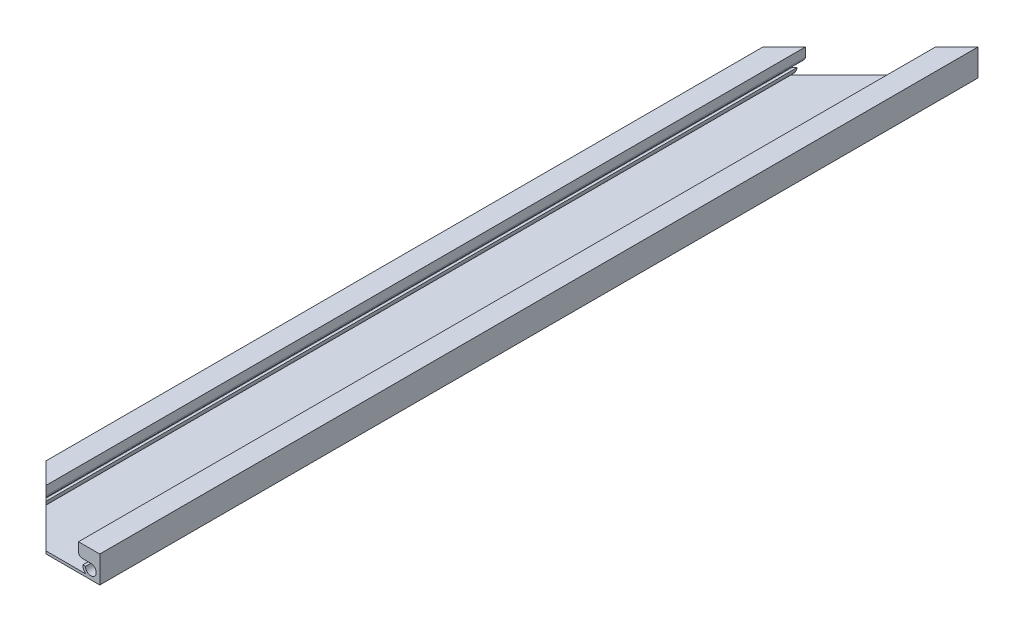
ISO-10303-21;
HEADER;
FILE_DESCRIPTION(('STEP AP214'),'2;1');
FILE_NAME('part.step','',(''),(''),'','','');
FILE_SCHEMA(('AUTOMOTIVE_DESIGN { 1 0 10303 214 1 1 1 1 }'));
ENDSEC;
DATA;
#1=APPLICATION_CONTEXT('core data for automotive mechanical design processes');
#2=APPLICATION_PROTOCOL_DEFINITION('international standard','automotive_design',2000,#1);
#3=PRODUCT_CONTEXT('',#1,'mechanical');
#4=PRODUCT('Part','Part','',(#3));
#5=PRODUCT_RELATED_PRODUCT_CATEGORY('part','',(#4));
#6=PRODUCT_DEFINITION_FORMATION('','',#4);
#7=PRODUCT_DEFINITION_CONTEXT('part definition',#1,'design');
#8=PRODUCT_DEFINITION('design','',#6,#7);
#9=PRODUCT_DEFINITION_SHAPE('','',#8);
#10=(LENGTH_UNIT() NAMED_UNIT(*) SI_UNIT(.MILLI.,.METRE.));
#11=(NAMED_UNIT(*) PLANE_ANGLE_UNIT() SI_UNIT($,.RADIAN.));
#12=(NAMED_UNIT(*) SI_UNIT($,.STERADIAN.) SOLID_ANGLE_UNIT());
#13=UNCERTAINTY_MEASURE_WITH_UNIT(LENGTH_MEASURE(1.E-05),#10,'distance_accuracy_value','');
#14=(GEOMETRIC_REPRESENTATION_CONTEXT(3) GLOBAL_UNCERTAINTY_ASSIGNED_CONTEXT((#13)) GLOBAL_UNIT_ASSIGNED_CONTEXT((#10,
#11,#12)) REPRESENTATION_CONTEXT('',''));
#15=CARTESIAN_POINT('',(0.,0.,0.));
#16=DIRECTION('',(0.,0.,1.));
#17=DIRECTION('',(1.,0.,0.));
#18=AXIS2_PLACEMENT_3D('',#15,#16,#17);
#19=CARTESIAN_POINT('',(-30.,7.5,520.));
#20=DIRECTION('',(0.,-1.,0.));
#21=DIRECTION('',(0.,0.,-1.));
#22=AXIS2_PLACEMENT_3D('',#19,#20,#21);
#23=PLANE('',#22);
#24=DIRECTION('',(0.707106781186546,0.,-0.707106781186549));
#25=VECTOR('',#24,1.);
#26=CARTESIAN_POINT('',(15.0000000000001,7.5,15.));
#27=LINE('',#26,#25);
#28=CARTESIAN_POINT('',(-30.,7.5,60.0000000000002));
#29=VERTEX_POINT('',#28);
#30=CARTESIAN_POINT('',(-18.1568883594902,7.5,48.1568883594904));
#31=VERTEX_POINT('',#30);
#32=EDGE_CURVE('E339',#29,#31,#27,.T.);
#33=ORIENTED_EDGE('',*,*,#32,.F.);
#34=DIRECTION('',(0.,0.,-1.));
#35=VECTOR('',#34,1.);
#36=CARTESIAN_POINT('',(-30.,7.5,520.));
#37=LINE('',#36,#35);
#38=CARTESIAN_POINT('',(-30.,7.5,460.));
#39=VERTEX_POINT('',#38);
#40=EDGE_CURVE('E202',#39,#29,#37,.T.);
#41=ORIENTED_EDGE('',*,*,#40,.F.);
#42=DIRECTION('',(0.707106781186546,0.,0.707106781186549));
#43=VECTOR('',#42,1.);
#44=CARTESIAN_POINT('',(-245.,7.5,244.999999999999));
#45=LINE('',#44,#43);
#46=CARTESIAN_POINT('',(-18.1568883594903,7.5,471.84311164051));
#47=VERTEX_POINT('',#46);
#48=EDGE_CURVE('E350',#39,#47,#45,.T.);
#49=ORIENTED_EDGE('',*,*,#48,.T.);
#50=DIRECTION('',(0.,0.,-1.));
#51=VECTOR('',#50,1.);
#52=CARTESIAN_POINT('',(-18.1568883594903,7.5,520.));
#53=LINE('',#52,#51);
#54=EDGE_CURVE('E288',#47,#31,#53,.T.);
#55=ORIENTED_EDGE('',*,*,#54,.T.);
#56=EDGE_LOOP('',(#33,#41,#49,#55));
#57=FACE_BOUND('',#56,.T.);
#58=ADVANCED_FACE('F43',(#57),#23,.F.);
#59=CARTESIAN_POINT('',(25.,0.5,520.));
#60=DIRECTION('',(0.,1.,0.));
#61=DIRECTION('',(-1.,0.,0.));
#62=AXIS2_PLACEMENT_3D('',#59,#60,#61);
#63=PLANE('',#62);
#64=DIRECTION('',(-0.707106781186546,0.,0.707106781186549));
#65=VECTOR('',#64,1.);
#66=CARTESIAN_POINT('',(-232.5,0.499999999999999,262.500000000001));
#67=LINE('',#66,#65);
#68=CARTESIAN_POINT('',(-20.1568883594903,0.5,50.1568883594904));
#69=VERTEX_POINT('',#68);
#70=CARTESIAN_POINT('',(-25.,0.5,55.0000000000002));
#71=VERTEX_POINT('',#70);
#72=EDGE_CURVE('E278',#69,#71,#67,.T.);
#73=ORIENTED_EDGE('',*,*,#72,.F.);
#74=DIRECTION('',(0.,0.,-1.));
#75=VECTOR('',#74,1.);
#76=CARTESIAN_POINT('',(-20.1568883594903,0.5,520.));
#77=LINE('',#76,#75);
#78=CARTESIAN_POINT('',(-20.1568883594903,0.5,469.84311164051));
#79=VERTEX_POINT('',#78);
#80=EDGE_CURVE('E221',#69,#79,#77,.F.);
#81=ORIENTED_EDGE('',*,*,#80,.T.);
#82=DIRECTION('',(-0.707106781186546,0.,-0.707106781186549));
#83=VECTOR('',#82,1.);
#84=CARTESIAN_POINT('',(27.5,0.5,517.5));
#85=LINE('',#84,#83);
#86=CARTESIAN_POINT('',(-25.,0.5,465.));
#87=VERTEX_POINT('',#86);
#88=EDGE_CURVE('E369',#79,#87,#85,.T.);
#89=ORIENTED_EDGE('',*,*,#88,.T.);
#90=DIRECTION('',(0.,0.,-1.));
#91=VECTOR('',#90,1.);
#92=CARTESIAN_POINT('',(-25.,0.5,520.));
#93=LINE('',#92,#91);
#94=EDGE_CURVE('E301',#87,#71,#93,.T.);
#95=ORIENTED_EDGE('',*,*,#94,.T.);
#96=EDGE_LOOP('',(#73,#81,#89,#95));
#97=FACE_BOUND('',#96,.T.);
#98=ADVANCED_FACE('F387',(#97),#63,.F.);
#99=DIRECTION('',(0.,0.,-1.));
#100=VECTOR('',#99,1.);
#101=CARTESIAN_POINT('',(18.1431116405097,7.5,520.));
#102=LINE('',#101,#100);
#103=CARTESIAN_POINT('',(18.1431116405097,7.5,490.));
#104=VERTEX_POINT('',#103);
#105=CARTESIAN_POINT('',(18.1431116405098,7.5,11.8568883594903));
#106=VERTEX_POINT('',#105);
#107=EDGE_CURVE('E193',#104,#106,#102,.T.);
#108=ORIENTED_EDGE('',*,*,#107,.F.);
#109=DIRECTION('',(1.,0.,0.));
#110=VECTOR('',#109,1.);
#111=CARTESIAN_POINT('',(30.,7.5,490.));
#112=LINE('',#111,#110);
#113=CARTESIAN_POINT('',(30.,7.5,490.));
#114=VERTEX_POINT('',#113);
#115=EDGE_CURVE('E177',#104,#114,#112,.T.);
#116=ORIENTED_EDGE('',*,*,#115,.T.);
#117=DIRECTION('',(0.,0.,-1.));
#118=VECTOR('',#117,1.);
#119=CARTESIAN_POINT('',(30.,7.5,520.));
#120=LINE('',#119,#118);
#121=CARTESIAN_POINT('',(30.,7.5,0.));
#122=VERTEX_POINT('',#121);
#123=EDGE_CURVE('E191',#114,#122,#120,.T.);
#124=ORIENTED_EDGE('',*,*,#123,.T.);
#125=EDGE_CURVE('E346',#106,#122,#27,.T.);
#126=ORIENTED_EDGE('',*,*,#125,.F.);
#127=EDGE_LOOP('',(#108,#116,#124,#126));
#128=FACE_BOUND('',#127,.T.);
#129=ADVANCED_FACE('F189',(#128),#23,.F.);
#130=CARTESIAN_POINT('',(-30.,7.5,520.));
#131=DIRECTION('',(1.,0.,0.));
#132=DIRECTION('',(0.,1.,0.));
#133=AXIS2_PLACEMENT_3D('',#130,#131,#132);
#134=PLANE('',#133);
#135=DIRECTION('',(0.,-1.,0.));
#136=VECTOR('',#135,1.);
#137=CARTESIAN_POINT('',(-30.,7.5,60.0000000000002));
#138=LINE('',#137,#136);
#139=CARTESIAN_POINT('',(-30.,-7.5,60.0000000000002));
#140=VERTEX_POINT('',#139);
#141=EDGE_CURVE('E335',#29,#140,#138,.T.);
#142=ORIENTED_EDGE('',*,*,#141,.T.);
#143=DIRECTION('',(0.,0.,-1.));
#144=VECTOR('',#143,1.);
#145=CARTESIAN_POINT('',(-30.,-7.5,520.));
#146=LINE('',#145,#144);
#147=CARTESIAN_POINT('',(-30.,-7.5,460.));
#148=VERTEX_POINT('',#147);
#149=EDGE_CURVE('E210',#148,#140,#146,.T.);
#150=ORIENTED_EDGE('',*,*,#149,.F.);
#151=DIRECTION('',(0.,-1.,0.));
#152=VECTOR('',#151,1.);
#153=CARTESIAN_POINT('',(-30.,7.5,460.));
#154=LINE('',#153,#152);
#155=EDGE_CURVE('E333',#39,#148,#154,.T.);
#156=ORIENTED_EDGE('',*,*,#155,.F.);
#157=ORIENTED_EDGE('',*,*,#40,.T.);
#158=EDGE_LOOP('',(#142,#150,#156,#157));
#159=FACE_BOUND('',#158,.T.);
#160=ADVANCED_FACE('F332',(#159),#134,.F.);
#161=CARTESIAN_POINT('',(-30.,-7.5,520.));
#162=DIRECTION('',(0.,1.,0.));
#163=DIRECTION('',(0.,0.,1.));
#164=AXIS2_PLACEMENT_3D('',#161,#162,#163);
#165=PLANE('',#164);
#166=DIRECTION('',(0.,0.,-1.));
#167=VECTOR('',#166,1.);
#168=CARTESIAN_POINT('',(30.,-7.5,520.));
#169=LINE('',#168,#167);
#170=CARTESIAN_POINT('',(30.,-7.5,490.));
#171=VERTEX_POINT('',#170);
#172=CARTESIAN_POINT('',(30.,-7.5,0.));
#173=VERTEX_POINT('',#172);
#174=EDGE_CURVE('E317',#171,#173,#169,.T.);
#175=ORIENTED_EDGE('',*,*,#174,.F.);
#176=DIRECTION('',(-1.,0.,0.));
#177=VECTOR('',#176,1.);
#178=CARTESIAN_POINT('',(-30.,-7.5,490.));
#179=LINE('',#178,#177);
#180=CARTESIAN_POINT('',(0.,-7.5,490.));
#181=VERTEX_POINT('',#180);
#182=EDGE_CURVE('E180',#171,#181,#179,.T.);
#183=ORIENTED_EDGE('',*,*,#182,.T.);
#184=DIRECTION('',(0.707106781186546,0.,0.707106781186549));
#185=VECTOR('',#184,1.);
#186=CARTESIAN_POINT('',(-245.,-7.5,244.999999999999));
#187=LINE('',#186,#185);
#188=EDGE_CURVE('E328',#148,#181,#187,.T.);
#189=ORIENTED_EDGE('',*,*,#188,.F.);
#190=ORIENTED_EDGE('',*,*,#149,.T.);
#191=DIRECTION('',(0.707106781186546,0.,-0.707106781186549));
#192=VECTOR('',#191,1.);
#193=CARTESIAN_POINT('',(15.0000000000001,-7.5,15.));
#194=LINE('',#193,#192);
#195=EDGE_CURVE('E326',#140,#173,#194,.T.);
#196=ORIENTED_EDGE('',*,*,#195,.T.);
#197=EDGE_LOOP('',(#175,#183,#189,#190,#196));
#198=FACE_BOUND('',#197,.T.);
#199=ADVANCED_FACE('F325',(#198),#165,.F.);
#200=CARTESIAN_POINT('',(-25.,-2.5,520.));
#201=DIRECTION('',(0.,0.,-1.));
#202=DIRECTION('',(-1.,0.,0.));
#203=AXIS2_PLACEMENT_3D('',#200,#201,#202);
#204=CYLINDRICAL_SURFACE('',#203,3.);
#205=CARTESIAN_POINT('',(-25.,-2.5,55.0000000000002));
#206=DIRECTION('',(-0.707106781186549,0.,-0.707106781186546));
#207=DIRECTION('',(0.707106781186546,0.,-0.707106781186549));
#208=AXIS2_PLACEMENT_3D('',#205,#206,#207);
#209=ELLIPSE('',#208,4.2426406871193,3.);
#210=CARTESIAN_POINT('',(-22.,-2.5,52.0000000000001));
#211=VERTEX_POINT('',#210);
#212=EDGE_CURVE('E275',#71,#211,#209,.F.);
#213=ORIENTED_EDGE('',*,*,#212,.F.);
#214=ORIENTED_EDGE('',*,*,#94,.F.);
#215=CARTESIAN_POINT('',(-25.,-2.5,465.));
#216=DIRECTION('',(0.707106781186549,0.,-0.707106781186546));
#217=DIRECTION('',(-0.707106781186546,0.,-0.707106781186549));
#218=AXIS2_PLACEMENT_3D('',#215,#216,#217);
#219=ELLIPSE('',#218,4.2426406871193,3.);
#220=CARTESIAN_POINT('',(-22.,-2.5,468.));
#221=VERTEX_POINT('',#220);
#222=EDGE_CURVE('E365',#87,#221,#219,.F.);
#223=ORIENTED_EDGE('',*,*,#222,.T.);
#224=DIRECTION('',(0.,0.,-1.));
#225=VECTOR('',#224,1.);
#226=CARTESIAN_POINT('',(-22.,-2.5,520.));
#227=LINE('',#226,#225);
#228=EDGE_CURVE('E207',#221,#211,#227,.T.);
#229=ORIENTED_EDGE('',*,*,#228,.T.);
#230=EDGE_LOOP('',(#213,#214,#223,#229));
#231=FACE_BOUND('',#230,.T.);
#232=ADVANCED_FACE('F390',(#231),#204,.F.);
#233=CARTESIAN_POINT('',(25.,-2.5,520.));
#234=DIRECTION('',(0.,0.,-1.));
#235=DIRECTION('',(-1.,0.,0.));
#236=AXIS2_PLACEMENT_3D('',#233,#234,#235);
#237=CYLINDRICAL_SURFACE('',#236,3.);
#238=DIRECTION('',(0.,0.,-1.));
#239=VECTOR('',#238,1.);
#240=CARTESIAN_POINT('',(22.,-2.5,520.));
#241=LINE('',#240,#239);
#242=CARTESIAN_POINT('',(22.,-2.5,8.00000000000001));
#243=VERTEX_POINT('',#242);
#244=CARTESIAN_POINT('',(22.,-2.5,490.));
#245=VERTEX_POINT('',#244);
#246=EDGE_CURVE('E201',#243,#245,#241,.F.);
#247=ORIENTED_EDGE('',*,*,#246,.T.);
#248=CARTESIAN_POINT('',(25.,-2.5,490.));
#249=DIRECTION('',(0.,0.,-1.));
#250=DIRECTION('',(-1.,0.,0.));
#251=AXIS2_PLACEMENT_3D('',#248,#249,#250);
#252=CIRCLE('',#251,3.);
#253=CARTESIAN_POINT('',(25.,0.5,490.));
#254=VERTEX_POINT('',#253);
#255=EDGE_CURVE('E420',#245,#254,#252,.F.);
#256=ORIENTED_EDGE('',*,*,#255,.T.);
#257=DIRECTION('',(0.,0.,-1.));
#258=VECTOR('',#257,1.);
#259=CARTESIAN_POINT('',(25.,0.5,520.));
#260=LINE('',#259,#258);
#261=CARTESIAN_POINT('',(25.,0.5,5.));
#262=VERTEX_POINT('',#261);
#263=EDGE_CURVE('E298',#254,#262,#260,.T.);
#264=ORIENTED_EDGE('',*,*,#263,.T.);
#265=CARTESIAN_POINT('',(25.,-2.5,5.));
#266=DIRECTION('',(-0.707106781186549,0.,-0.707106781186546));
#267=DIRECTION('',(0.707106781186546,0.,-0.707106781186549));
#268=AXIS2_PLACEMENT_3D('',#265,#266,#267);
#269=ELLIPSE('',#268,4.2426406871193,3.);
#270=EDGE_CURVE('E249',#243,#262,#269,.F.);
#271=ORIENTED_EDGE('',*,*,#270,.F.);
#272=EDGE_LOOP('',(#247,#256,#264,#271));
#273=FACE_BOUND('',#272,.T.);
#274=ADVANCED_FACE('F419',(#273),#237,.F.);
#275=ORIENTED_EDGE('',*,*,#263,.F.);
#276=DIRECTION('',(-1.,0.,0.));
#277=VECTOR('',#276,1.);
#278=CARTESIAN_POINT('',(25.,0.5,490.));
#279=LINE('',#278,#277);
#280=CARTESIAN_POINT('',(20.1431116405097,0.5,490.));
#281=VERTEX_POINT('',#280);
#282=EDGE_CURVE('E423',#254,#281,#279,.T.);
#283=ORIENTED_EDGE('',*,*,#282,.T.);
#284=DIRECTION('',(0.,0.,-1.));
#285=VECTOR('',#284,1.);
#286=CARTESIAN_POINT('',(20.1431116405097,0.5,520.));
#287=LINE('',#286,#285);
#288=CARTESIAN_POINT('',(20.1431116405097,0.5,9.85688835949028));
#289=VERTEX_POINT('',#288);
#290=EDGE_CURVE('E66',#281,#289,#287,.T.);
#291=ORIENTED_EDGE('',*,*,#290,.T.);
#292=DIRECTION('',(-0.707106781186546,0.,0.707106781186549));
#293=VECTOR('',#292,1.);
#294=CARTESIAN_POINT('',(-232.5,0.499999999999999,262.500000000001));
#295=LINE('',#294,#293);
#296=EDGE_CURVE('E241',#262,#289,#295,.T.);
#297=ORIENTED_EDGE('',*,*,#296,.F.);
#298=EDGE_LOOP('',(#275,#283,#291,#297));
#299=FACE_BOUND('',#298,.T.);
#300=ADVANCED_FACE('F422',(#299),#63,.F.);
#301=CARTESIAN_POINT('',(-25.,-2.5,520.));
#302=DIRECTION('',(0.,-1.,0.));
#303=DIRECTION('',(1.,0.,0.));
#304=AXIS2_PLACEMENT_3D('',#301,#302,#303);
#305=PLANE('',#304);
#306=DIRECTION('',(0.707106781186546,0.,-0.707106781186549));
#307=VECTOR('',#306,1.);
#308=CARTESIAN_POINT('',(-257.5,-2.49999999999993,287.500000000001));
#309=LINE('',#308,#307);
#310=CARTESIAN_POINT('',(-20.5,-2.5,50.5000000000002));
#311=VERTEX_POINT('',#310);
#312=EDGE_CURVE('E272',#211,#311,#309,.T.);
#313=ORIENTED_EDGE('',*,*,#312,.F.);
#314=ORIENTED_EDGE('',*,*,#228,.F.);
#315=DIRECTION('',(0.707106781186546,0.,0.707106781186549));
#316=VECTOR('',#315,1.);
#317=CARTESIAN_POINT('',(2.50000000000011,-2.50000000000001,492.5));
#318=LINE('',#317,#316);
#319=CARTESIAN_POINT('',(-20.5,-2.5,469.5));
#320=VERTEX_POINT('',#319);
#321=EDGE_CURVE('E361',#221,#320,#318,.T.);
#322=ORIENTED_EDGE('',*,*,#321,.T.);
#323=DIRECTION('',(0.,0.,-1.));
#324=VECTOR('',#323,1.);
#325=CARTESIAN_POINT('',(-20.5,-2.5,520.));
#326=LINE('',#325,#324);
#327=EDGE_CURVE('E305',#320,#311,#326,.T.);
#328=ORIENTED_EDGE('',*,*,#327,.T.);
#329=EDGE_LOOP('',(#313,#314,#322,#328));
#330=FACE_BOUND('',#329,.T.);
#331=ADVANCED_FACE('F395',(#330),#305,.F.);
#332=CARTESIAN_POINT('',(20.5,-2.5,520.));
#333=DIRECTION('',(0.,-1.,0.));
#334=DIRECTION('',(1.,0.,0.));
#335=AXIS2_PLACEMENT_3D('',#332,#333,#334);
#336=PLANE('',#335);
#337=DIRECTION('',(0.,0.,-1.));
#338=VECTOR('',#337,1.);
#339=CARTESIAN_POINT('',(20.5,-2.5,520.));
#340=LINE('',#339,#338);
#341=CARTESIAN_POINT('',(20.5,-2.5,490.));
#342=VERTEX_POINT('',#341);
#343=CARTESIAN_POINT('',(20.5,-2.5,9.49999999999995));
#344=VERTEX_POINT('',#343);
#345=EDGE_CURVE('E295',#342,#344,#340,.T.);
#346=ORIENTED_EDGE('',*,*,#345,.F.);
#347=DIRECTION('',(1.,0.,0.));
#348=VECTOR('',#347,1.);
#349=CARTESIAN_POINT('',(20.5,-2.5,490.));
#350=LINE('',#349,#348);
#351=EDGE_CURVE('E416',#342,#245,#350,.T.);
#352=ORIENTED_EDGE('',*,*,#351,.T.);
#353=ORIENTED_EDGE('',*,*,#246,.F.);
#354=DIRECTION('',(0.707106781186546,0.,-0.707106781186549));
#355=VECTOR('',#354,1.);
#356=CARTESIAN_POINT('',(-234.75,-2.49999999999998,264.750000000001));
#357=LINE('',#356,#355);
#358=EDGE_CURVE('E258',#344,#243,#357,.T.);
#359=ORIENTED_EDGE('',*,*,#358,.F.);
#360=EDGE_LOOP('',(#346,#352,#353,#359));
#361=FACE_BOUND('',#360,.T.);
#362=ADVANCED_FACE('F414',(#361),#336,.F.);
#363=CARTESIAN_POINT('',(25.,-2.5,520.));
#364=DIRECTION('',(0.,0.,-1.));
#365=DIRECTION('',(-1.,0.,0.));
#366=AXIS2_PLACEMENT_3D('',#363,#364,#365);
#367=CYLINDRICAL_SURFACE('',#366,4.5);
#368=DIRECTION('',(0.,0.,-1.));
#369=VECTOR('',#368,1.);
#370=CARTESIAN_POINT('',(22.1715728752538,-6.,520.));
#371=LINE('',#370,#369);
#372=CARTESIAN_POINT('',(22.1715728752538,-5.99999999999999,490.));
#373=VERTEX_POINT('',#372);
#374=CARTESIAN_POINT('',(22.1715728752538,-6.,7.82842712474618));
#375=VERTEX_POINT('',#374);
#376=EDGE_CURVE('E291',#373,#375,#371,.T.);
#377=ORIENTED_EDGE('',*,*,#376,.F.);
#378=CARTESIAN_POINT('',(25.,-2.5,490.));
#379=DIRECTION('',(0.,0.,-1.));
#380=DIRECTION('',(-1.,0.,0.));
#381=AXIS2_PLACEMENT_3D('',#378,#379,#380);
#382=CIRCLE('',#381,4.5);
#383=EDGE_CURVE('E408',#373,#342,#382,.T.);
#384=ORIENTED_EDGE('',*,*,#383,.T.);
#385=ORIENTED_EDGE('',*,*,#345,.T.);
#386=CARTESIAN_POINT('',(25.,-2.5,5.));
#387=DIRECTION('',(-0.707106781186549,0.,-0.707106781186546));
#388=DIRECTION('',(0.707106781186546,0.,-0.707106781186549));
#389=AXIS2_PLACEMENT_3D('',#386,#387,#388);
#390=ELLIPSE('',#389,6.36396103067894,4.5);
#391=EDGE_CURVE('E261',#375,#344,#390,.T.);
#392=ORIENTED_EDGE('',*,*,#391,.F.);
#393=EDGE_LOOP('',(#377,#384,#385,#392));
#394=FACE_BOUND('',#393,.T.);
#395=ADVANCED_FACE('F407',(#394),#367,.T.);
#396=CARTESIAN_POINT('',(-25.,-2.5,520.));
#397=DIRECTION('',(0.,0.,-1.));
#398=DIRECTION('',(-1.,0.,0.));
#399=AXIS2_PLACEMENT_3D('',#396,#397,#398);
#400=CYLINDRICAL_SURFACE('',#399,4.5);
#401=CARTESIAN_POINT('',(-25.,-2.5,55.0000000000002));
#402=DIRECTION('',(-0.707106781186549,0.,-0.707106781186546));
#403=DIRECTION('',(0.707106781186546,0.,-0.707106781186549));
#404=AXIS2_PLACEMENT_3D('',#401,#402,#403);
#405=ELLIPSE('',#404,6.36396103067895,4.5);
#406=CARTESIAN_POINT('',(-22.1715728752538,-6.,52.1715728752539));
#407=VERTEX_POINT('',#406);
#408=EDGE_CURVE('E269',#311,#407,#405,.T.);
#409=ORIENTED_EDGE('',*,*,#408,.F.);
#410=ORIENTED_EDGE('',*,*,#327,.F.);
#411=CARTESIAN_POINT('',(-25.,-2.5,465.));
#412=DIRECTION('',(0.707106781186549,0.,-0.707106781186546));
#413=DIRECTION('',(-0.707106781186546,0.,-0.707106781186549));
#414=AXIS2_PLACEMENT_3D('',#411,#412,#413);
#415=ELLIPSE('',#414,6.36396103067895,4.5);
#416=CARTESIAN_POINT('',(-22.1715728752538,-6.,467.828427124746));
#417=VERTEX_POINT('',#416);
#418=EDGE_CURVE('E344',#320,#417,#415,.T.);
#419=ORIENTED_EDGE('',*,*,#418,.T.);
#420=DIRECTION('',(0.,0.,-1.));
#421=VECTOR('',#420,1.);
#422=CARTESIAN_POINT('',(-22.1715728752538,-6.,520.));
#423=LINE('',#422,#421);
#424=EDGE_CURVE('E309',#417,#407,#423,.T.);
#425=ORIENTED_EDGE('',*,*,#424,.T.);
#426=EDGE_LOOP('',(#409,#410,#419,#425));
#427=FACE_BOUND('',#426,.T.);
#428=ADVANCED_FACE('F398',(#427),#400,.T.);
#429=CARTESIAN_POINT('',(22.1715728752538,-6.,520.));
#430=DIRECTION('',(0.,-1.,0.));
#431=DIRECTION('',(0.,0.,-1.));
#432=AXIS2_PLACEMENT_3D('',#429,#430,#431);
#433=PLANE('',#432);
#434=DIRECTION('',(0.707106781186546,0.,0.707106781186549));
#435=VECTOR('',#434,1.);
#436=CARTESIAN_POINT('',(26.0857864376269,-6.,516.085786437627));
#437=LINE('',#436,#435);
#438=CARTESIAN_POINT('',(0.,-6.,490.));
#439=VERTEX_POINT('',#438);
#440=EDGE_CURVE('E338',#417,#439,#437,.T.);
#441=ORIENTED_EDGE('',*,*,#440,.T.);
#442=DIRECTION('',(1.,0.,0.));
#443=VECTOR('',#442,1.);
#444=CARTESIAN_POINT('',(22.1715728752538,-6.,490.));
#445=LINE('',#444,#443);
#446=EDGE_CURVE('E59',#439,#373,#445,.T.);
#447=ORIENTED_EDGE('',*,*,#446,.T.);
#448=ORIENTED_EDGE('',*,*,#376,.T.);
#449=DIRECTION('',(0.707106781186546,0.,-0.707106781186549));
#450=VECTOR('',#449,1.);
#451=CARTESIAN_POINT('',(-233.914213562373,-6.,263.914213562374));
#452=LINE('',#451,#450);
#453=EDGE_CURVE('E265',#407,#375,#452,.T.);
#454=ORIENTED_EDGE('',*,*,#453,.F.);
#455=ORIENTED_EDGE('',*,*,#424,.F.);
#456=EDGE_LOOP('',(#441,#447,#448,#454,#455));
#457=FACE_BOUND('',#456,.T.);
#458=ADVANCED_FACE('F403',(#457),#433,.F.);
#459=CARTESIAN_POINT('',(18.1431116405097,0.5,520.));
#460=DIRECTION('',(1.,0.,0.));
#461=DIRECTION('',(0.,0.,-1.));
#462=AXIS2_PLACEMENT_3D('',#459,#460,#461);
#463=PLANE('',#462);
#464=DIRECTION('',(0.,0.,-1.));
#465=VECTOR('',#464,1.);
#466=CARTESIAN_POINT('',(18.1431116405097,2.5,520.));
#467=LINE('',#466,#465);
#468=CARTESIAN_POINT('',(18.1431116405097,2.5,11.8568883594903));
#469=VERTEX_POINT('',#468);
#470=CARTESIAN_POINT('',(18.1431116405097,2.5,490.));
#471=VERTEX_POINT('',#470);
#472=EDGE_CURVE('E227',#469,#471,#467,.F.);
#473=ORIENTED_EDGE('',*,*,#472,.T.);
#474=DIRECTION('',(0.,1.,0.));
#475=VECTOR('',#474,1.);
#476=CARTESIAN_POINT('',(18.1431116405097,0.5,490.));
#477=LINE('',#476,#475);
#478=EDGE_CURVE('E425',#471,#104,#477,.T.);
#479=ORIENTED_EDGE('',*,*,#478,.T.);
#480=ORIENTED_EDGE('',*,*,#107,.T.);
#481=DIRECTION('',(0.,1.,0.));
#482=VECTOR('',#481,1.);
#483=CARTESIAN_POINT('',(18.1431116405097,0.5,11.8568883594903));
#484=LINE('',#483,#482);
#485=EDGE_CURVE('E239',#469,#106,#484,.T.);
#486=ORIENTED_EDGE('',*,*,#485,.F.);
#487=EDGE_LOOP('',(#473,#479,#480,#486));
#488=FACE_BOUND('',#487,.T.);
#489=ADVANCED_FACE('F243',(#488),#463,.F.);
#490=CARTESIAN_POINT('',(-18.1568883594903,7.5,520.));
#491=DIRECTION('',(-1.,0.,0.));
#492=DIRECTION('',(0.,0.,1.));
#493=AXIS2_PLACEMENT_3D('',#490,#491,#492);
#494=PLANE('',#493);
#495=DIRECTION('',(0.,-1.,0.));
#496=VECTOR('',#495,1.);
#497=CARTESIAN_POINT('',(-18.1568883594903,7.5,48.1568883594904));
#498=LINE('',#497,#496);
#499=CARTESIAN_POINT('',(-18.1568883594903,2.5,48.1568883594905));
#500=VERTEX_POINT('',#499);
#501=EDGE_CURVE('E285',#31,#500,#498,.T.);
#502=ORIENTED_EDGE('',*,*,#501,.F.);
#503=ORIENTED_EDGE('',*,*,#54,.F.);
#504=DIRECTION('',(0.,-1.,0.));
#505=VECTOR('',#504,1.);
#506=CARTESIAN_POINT('',(-18.1568883594903,7.5,471.84311164051));
#507=LINE('',#506,#505);
#508=CARTESIAN_POINT('',(-18.1568883594903,2.5,471.84311164051));
#509=VERTEX_POINT('',#508);
#510=EDGE_CURVE('E245',#47,#509,#507,.T.);
#511=ORIENTED_EDGE('',*,*,#510,.T.);
#512=DIRECTION('',(0.,0.,-1.));
#513=VECTOR('',#512,1.);
#514=CARTESIAN_POINT('',(-18.1568883594903,2.5,520.));
#515=LINE('',#514,#513);
#516=EDGE_CURVE('E217',#509,#500,#515,.T.);
#517=ORIENTED_EDGE('',*,*,#516,.T.);
#518=EDGE_LOOP('',(#502,#503,#511,#517));
#519=FACE_BOUND('',#518,.T.);
#520=ADVANCED_FACE('F382',(#519),#494,.F.);
#521=CARTESIAN_POINT('',(-20.1568883594903,2.5,520.));
#522=DIRECTION('',(0.,0.,-1.));
#523=DIRECTION('',(-1.,0.,0.));
#524=AXIS2_PLACEMENT_3D('',#521,#522,#523);
#525=CYLINDRICAL_SURFACE('',#524,2.);
#526=ORIENTED_EDGE('',*,*,#80,.F.);
#527=CARTESIAN_POINT('',(-20.1568883594903,2.5,50.1568883594905));
#528=DIRECTION('',(-0.707106781186549,0.,-0.707106781186546));
#529=DIRECTION('',(0.707106781186546,0.,-0.707106781186549));
#530=AXIS2_PLACEMENT_3D('',#527,#528,#529);
#531=ELLIPSE('',#530,2.8284271247462,2.);
#532=EDGE_CURVE('E281',#69,#500,#531,.F.);
#533=ORIENTED_EDGE('',*,*,#532,.T.);
#534=ORIENTED_EDGE('',*,*,#516,.F.);
#535=CARTESIAN_POINT('',(-20.1568883594903,2.5,469.84311164051));
#536=DIRECTION('',(0.707106781186549,0.,-0.707106781186546));
#537=DIRECTION('',(-0.707106781186546,0.,-0.707106781186549));
#538=AXIS2_PLACEMENT_3D('',#535,#536,#537);
#539=ELLIPSE('',#538,2.8284271247462,2.);
#540=EDGE_CURVE('E252',#79,#509,#539,.F.);
#541=ORIENTED_EDGE('',*,*,#540,.F.);
#542=EDGE_LOOP('',(#526,#533,#534,#541));
#543=FACE_BOUND('',#542,.T.);
#544=ADVANCED_FACE('F383',(#543),#525,.T.);
#545=CARTESIAN_POINT('',(20.1431116405097,2.5,520.));
#546=DIRECTION('',(0.,0.,-1.));
#547=DIRECTION('',(-1.,0.,0.));
#548=AXIS2_PLACEMENT_3D('',#545,#546,#547);
#549=CYLINDRICAL_SURFACE('',#548,2.);
#550=CARTESIAN_POINT('',(20.1431116405097,2.5,490.));
#551=DIRECTION('',(0.,0.,-1.));
#552=DIRECTION('',(-1.,0.,0.));
#553=AXIS2_PLACEMENT_3D('',#550,#551,#552);
#554=CIRCLE('',#553,2.);
#555=EDGE_CURVE('E185',#471,#281,#554,.F.);
#556=ORIENTED_EDGE('',*,*,#555,.F.);
#557=ORIENTED_EDGE('',*,*,#472,.F.);
#558=CARTESIAN_POINT('',(20.1431116405097,2.5,9.85688835949028));
#559=DIRECTION('',(-0.707106781186549,0.,-0.707106781186546));
#560=DIRECTION('',(0.707106781186546,0.,-0.707106781186549));
#561=AXIS2_PLACEMENT_3D('',#558,#559,#560);
#562=ELLIPSE('',#561,2.8284271247462,2.);
#563=EDGE_CURVE('E52',#469,#289,#562,.F.);
#564=ORIENTED_EDGE('',*,*,#563,.T.);
#565=ORIENTED_EDGE('',*,*,#290,.F.);
#566=EDGE_LOOP('',(#556,#557,#564,#565));
#567=FACE_BOUND('',#566,.T.);
#568=ADVANCED_FACE('F45',(#567),#549,.T.);
#569=CARTESIAN_POINT('',(30.,7.5,520.));
#570=DIRECTION('',(-1.,0.,0.));
#571=DIRECTION('',(0.,-1.,0.));
#572=AXIS2_PLACEMENT_3D('',#569,#570,#571);
#573=PLANE('',#572);
#574=ORIENTED_EDGE('',*,*,#123,.F.);
#575=DIRECTION('',(0.,-1.,0.));
#576=VECTOR('',#575,1.);
#577=CARTESIAN_POINT('',(30.,7.5,490.));
#578=LINE('',#577,#576);
#579=EDGE_CURVE('E174',#114,#171,#578,.T.);
#580=ORIENTED_EDGE('',*,*,#579,.T.);
#581=ORIENTED_EDGE('',*,*,#174,.T.);
#582=DIRECTION('',(0.,1.,0.));
#583=VECTOR('',#582,1.);
#584=CARTESIAN_POINT('',(30.,7.5,0.));
#585=LINE('',#584,#583);
#586=EDGE_CURVE('E199',#173,#122,#585,.T.);
#587=ORIENTED_EDGE('',*,*,#586,.T.);
#588=EDGE_LOOP('',(#574,#580,#581,#587));
#589=FACE_BOUND('',#588,.T.);
#590=ADVANCED_FACE('F197',(#589),#573,.F.);
#591=CARTESIAN_POINT('',(-245.,7.5,244.999999999999));
#592=DIRECTION('',(0.707106781186549,0.,-0.707106781186546));
#593=DIRECTION('',(-0.707106781186546,0.,-0.707106781186549));
#594=AXIS2_PLACEMENT_3D('',#591,#592,#593);
#595=PLANE('',#594);
#596=ORIENTED_EDGE('',*,*,#188,.T.);
#597=DIRECTION('',(0.,1.,0.));
#598=VECTOR('',#597,1.);
#599=CARTESIAN_POINT('',(0.,7.5,490.));
#600=LINE('',#599,#598);
#601=EDGE_CURVE('E11',#181,#439,#600,.T.);
#602=ORIENTED_EDGE('',*,*,#601,.T.);
#603=ORIENTED_EDGE('',*,*,#440,.F.);
#604=ORIENTED_EDGE('',*,*,#418,.F.);
#605=ORIENTED_EDGE('',*,*,#321,.F.);
#606=ORIENTED_EDGE('',*,*,#222,.F.);
#607=ORIENTED_EDGE('',*,*,#88,.F.);
#608=ORIENTED_EDGE('',*,*,#540,.T.);
#609=ORIENTED_EDGE('',*,*,#510,.F.);
#610=ORIENTED_EDGE('',*,*,#48,.F.);
#611=ORIENTED_EDGE('',*,*,#155,.T.);
#612=EDGE_LOOP('',(#596,#602,#603,#604,#605,#606,#607,#608,#609,#610,#611));
#613=FACE_BOUND('',#612,.T.);
#614=ADVANCED_FACE('F375',(#613),#595,.F.);
#615=CARTESIAN_POINT('',(15.0000000000001,7.5,15.));
#616=DIRECTION('',(-0.707106781186549,0.,-0.707106781186546));
#617=DIRECTION('',(-0.707106781186546,0.,0.707106781186549));
#618=AXIS2_PLACEMENT_3D('',#615,#616,#617);
#619=PLANE('',#618);
#620=ORIENTED_EDGE('',*,*,#501,.T.);
#621=ORIENTED_EDGE('',*,*,#532,.F.);
#622=ORIENTED_EDGE('',*,*,#72,.T.);
#623=ORIENTED_EDGE('',*,*,#212,.T.);
#624=ORIENTED_EDGE('',*,*,#312,.T.);
#625=ORIENTED_EDGE('',*,*,#408,.T.);
#626=ORIENTED_EDGE('',*,*,#453,.T.);
#627=ORIENTED_EDGE('',*,*,#391,.T.);
#628=ORIENTED_EDGE('',*,*,#358,.T.);
#629=ORIENTED_EDGE('',*,*,#270,.T.);
#630=ORIENTED_EDGE('',*,*,#296,.T.);
#631=ORIENTED_EDGE('',*,*,#563,.F.);
#632=ORIENTED_EDGE('',*,*,#485,.T.);
#633=ORIENTED_EDGE('',*,*,#125,.T.);
#634=ORIENTED_EDGE('',*,*,#586,.F.);
#635=ORIENTED_EDGE('',*,*,#195,.F.);
#636=ORIENTED_EDGE('',*,*,#141,.F.);
#637=ORIENTED_EDGE('',*,*,#32,.T.);
#638=EDGE_LOOP('',(#620,#621,#622,#623,#624,#625,#626,#627,#628,#629,#630,#631,#632,#633,#634,
#635,#636,#637));
#639=FACE_BOUND('',#638,.T.);
#640=ADVANCED_FACE('F238',(#639),#619,.T.);
#641=CARTESIAN_POINT('',(30.,7.5,490.));
#642=DIRECTION('',(0.,0.,-1.));
#643=DIRECTION('',(-1.,0.,0.));
#644=AXIS2_PLACEMENT_3D('',#641,#642,#643);
#645=PLANE('',#644);
#646=ORIENTED_EDGE('',*,*,#579,.F.);
#647=ORIENTED_EDGE('',*,*,#115,.F.);
#648=ORIENTED_EDGE('',*,*,#478,.F.);
#649=ORIENTED_EDGE('',*,*,#555,.T.);
#650=ORIENTED_EDGE('',*,*,#282,.F.);
#651=ORIENTED_EDGE('',*,*,#255,.F.);
#652=ORIENTED_EDGE('',*,*,#351,.F.);
#653=ORIENTED_EDGE('',*,*,#383,.F.);
#654=ORIENTED_EDGE('',*,*,#446,.F.);
#655=ORIENTED_EDGE('',*,*,#601,.F.);
#656=ORIENTED_EDGE('',*,*,#182,.F.);
#657=EDGE_LOOP('',(#646,#647,#648,#649,#650,#651,#652,#653,#654,#655,#656));
#658=FACE_BOUND('',#657,.T.);
#659=ADVANCED_FACE('F176',(#658),#645,.F.);
#660=CLOSED_SHELL('',(#58,#98,#129,#160,#199,#232,#274,#300,#331,#362,#395,#428,#458,#489,#520,
#544,#568,#590,#614,#640,#659));
#661=MANIFOLD_SOLID_BREP('B2',#660);
#662=ADVANCED_BREP_SHAPE_REPRESENTATION('',(#18,#661),#14);
#663=SHAPE_DEFINITION_REPRESENTATION(#9,#662);
ENDSEC;
END-ISO-10303-21;
